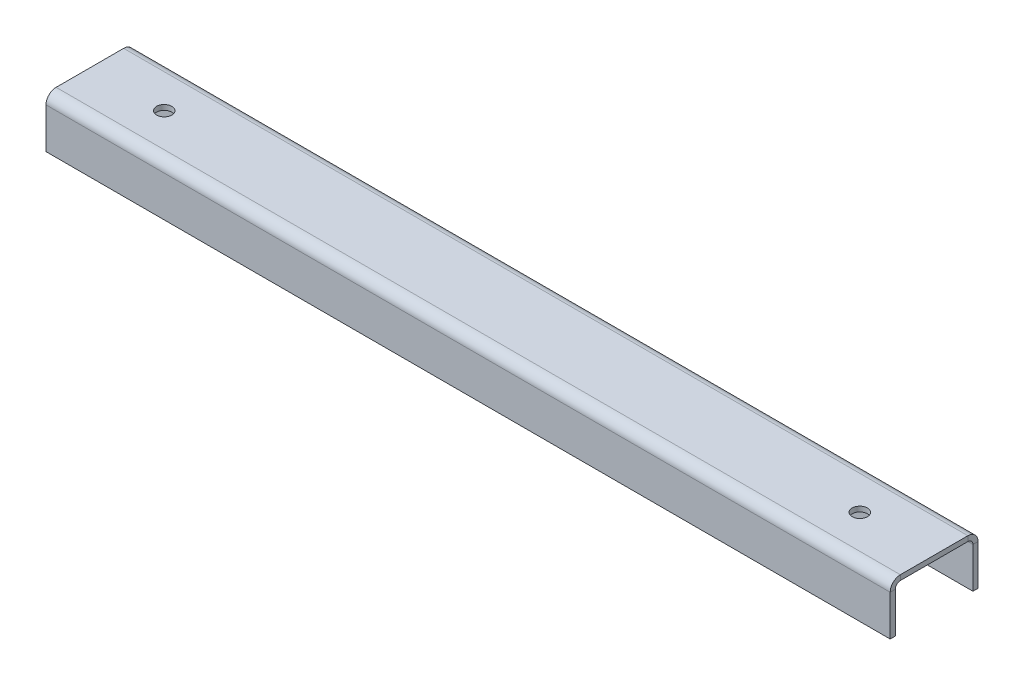
ISO-10303-21;
HEADER;
FILE_DESCRIPTION(('STEP AP214'),'2;1');
FILE_NAME('part.step','',(''),(''),'','','');
FILE_SCHEMA(('AUTOMOTIVE_DESIGN { 1 0 10303 214 1 1 1 1 }'));
ENDSEC;
DATA;
#1=APPLICATION_CONTEXT('core data for automotive mechanical design processes');
#2=APPLICATION_PROTOCOL_DEFINITION('international standard','automotive_design',2000,#1);
#3=PRODUCT_CONTEXT('',#1,'mechanical');
#4=PRODUCT('Part','Part','',(#3));
#5=PRODUCT_RELATED_PRODUCT_CATEGORY('part','',(#4));
#6=PRODUCT_DEFINITION_FORMATION('','',#4);
#7=PRODUCT_DEFINITION_CONTEXT('part definition',#1,'design');
#8=PRODUCT_DEFINITION('design','',#6,#7);
#9=PRODUCT_DEFINITION_SHAPE('','',#8);
#10=(LENGTH_UNIT() NAMED_UNIT(*) SI_UNIT(.MILLI.,.METRE.));
#11=(NAMED_UNIT(*) PLANE_ANGLE_UNIT() SI_UNIT($,.RADIAN.));
#12=(NAMED_UNIT(*) SI_UNIT($,.STERADIAN.) SOLID_ANGLE_UNIT());
#13=UNCERTAINTY_MEASURE_WITH_UNIT(LENGTH_MEASURE(1.E-05),#10,'distance_accuracy_value','');
#14=(GEOMETRIC_REPRESENTATION_CONTEXT(3) GLOBAL_UNCERTAINTY_ASSIGNED_CONTEXT((#13)) GLOBAL_UNIT_ASSIGNED_CONTEXT((#10,
#11,#12)) REPRESENTATION_CONTEXT('',''));
#15=CARTESIAN_POINT('',(0.,0.,0.));
#16=DIRECTION('',(0.,0.,1.));
#17=DIRECTION('',(1.,0.,0.));
#18=AXIS2_PLACEMENT_3D('',#15,#16,#17);
#19=CARTESIAN_POINT('',(198.448727021121,-33996.0636278408,-8130.29635445669));
#20=DIRECTION('',(-1.,0.,0.));
#21=DIRECTION('',(0.,0.,1.));
#22=AXIS2_PLACEMENT_3D('',#19,#20,#21);
#23=PLANE('',#22);
#24=DIRECTION('',(0.,0.,1.));
#25=VECTOR('',#24,1.);
#26=CARTESIAN_POINT('',(198.448727021121,-33993.0636278408,-8130.29635445669));
#27=LINE('',#26,#25);
#28=CARTESIAN_POINT('',(198.448727021121,-33993.0636278408,-8130.29635445669));
#29=VERTEX_POINT('',#28);
#30=CARTESIAN_POINT('',(198.448727021121,-33993.0636278408,-8090.29635445669));
#31=VERTEX_POINT('',#30);
#32=EDGE_CURVE('E270',#29,#31,#27,.T.);
#33=ORIENTED_EDGE('',*,*,#32,.F.);
#34=DIRECTION('',(0.,1.,0.));
#35=VECTOR('',#34,1.);
#36=CARTESIAN_POINT('',(198.448727021121,-33996.0636278408,-8130.29635445669));
#37=LINE('',#36,#35);
#38=CARTESIAN_POINT('',(198.448727021121,-33996.0636278408,-8130.29635445669));
#39=VERTEX_POINT('',#38);
#40=EDGE_CURVE('E13',#39,#29,#37,.T.);
#41=ORIENTED_EDGE('',*,*,#40,.F.);
#42=DIRECTION('',(0.,0.,1.));
#43=VECTOR('',#42,1.);
#44=CARTESIAN_POINT('',(198.448727021121,-33996.0636278408,-8130.29635445669));
#45=LINE('',#44,#43);
#46=CARTESIAN_POINT('',(198.448727021121,-33996.0636278408,-8090.29635445669));
#47=VERTEX_POINT('',#46);
#48=EDGE_CURVE('E273',#39,#47,#45,.T.);
#49=ORIENTED_EDGE('',*,*,#48,.T.);
#50=DIRECTION('',(0.,1.,0.));
#51=VECTOR('',#50,1.);
#52=CARTESIAN_POINT('',(198.448727021121,-33996.0636278408,-8090.29635445669));
#53=LINE('',#52,#51);
#54=EDGE_CURVE('E82',#47,#31,#53,.T.);
#55=ORIENTED_EDGE('',*,*,#54,.T.);
#56=EDGE_LOOP('',(#33,#41,#49,#55));
#57=FACE_BOUND('',#56,.T.);
#58=ADVANCED_FACE('F79',(#57),#23,.T.);
#59=CARTESIAN_POINT('',(698.448727021121,-33996.0636278408,-8130.29635445669));
#60=DIRECTION('',(1.,0.,0.));
#61=DIRECTION('',(0.,0.,-1.));
#62=AXIS2_PLACEMENT_3D('',#59,#60,#61);
#63=PLANE('',#62);
#64=DIRECTION('',(0.,0.,-1.));
#65=VECTOR('',#64,1.);
#66=CARTESIAN_POINT('',(698.448727021121,-33993.0636278408,-8130.29635445669));
#67=LINE('',#66,#65);
#68=CARTESIAN_POINT('',(698.448727021121,-33993.0636278408,-8090.29635445669));
#69=VERTEX_POINT('',#68);
#70=CARTESIAN_POINT('',(698.448727021121,-33993.0636278408,-8130.29635445669));
#71=VERTEX_POINT('',#70);
#72=EDGE_CURVE('E289',#69,#71,#67,.T.);
#73=ORIENTED_EDGE('',*,*,#72,.F.);
#74=DIRECTION('',(0.,1.,0.));
#75=VECTOR('',#74,1.);
#76=CARTESIAN_POINT('',(698.448727021121,-33996.0636278408,-8090.29635445669));
#77=LINE('',#76,#75);
#78=CARTESIAN_POINT('',(698.448727021121,-33996.0636278408,-8090.29635445669));
#79=VERTEX_POINT('',#78);
#80=EDGE_CURVE('E295',#79,#69,#77,.T.);
#81=ORIENTED_EDGE('',*,*,#80,.F.);
#82=DIRECTION('',(0.,0.,-1.));
#83=VECTOR('',#82,1.);
#84=CARTESIAN_POINT('',(698.448727021121,-33996.0636278408,-8130.29635445669));
#85=LINE('',#84,#83);
#86=CARTESIAN_POINT('',(698.448727021121,-33996.0636278408,-8130.29635445669));
#87=VERTEX_POINT('',#86);
#88=EDGE_CURVE('E279',#79,#87,#85,.T.);
#89=ORIENTED_EDGE('',*,*,#88,.T.);
#90=DIRECTION('',(0.,1.,0.));
#91=VECTOR('',#90,1.);
#92=CARTESIAN_POINT('',(698.448727021121,-33996.0636278408,-8130.29635445669));
#93=LINE('',#92,#91);
#94=EDGE_CURVE('E87',#87,#71,#93,.T.);
#95=ORIENTED_EDGE('',*,*,#94,.T.);
#96=EDGE_LOOP('',(#73,#81,#89,#95));
#97=FACE_BOUND('',#96,.T.);
#98=ADVANCED_FACE('F315',(#97),#63,.T.);
#99=CARTESIAN_POINT('',(0.,-33996.0636278408,0.));
#100=DIRECTION('',(0.,1.,0.));
#101=DIRECTION('',(0.,0.,1.));
#102=AXIS2_PLACEMENT_3D('',#99,#100,#101);
#103=PLANE('',#102);
#104=CARTESIAN_POINT('',(654.448727021121,-33996.0636278408,-8110.29635445669));
#105=DIRECTION('',(0.,1.,0.));
#106=DIRECTION('',(0.,0.,1.));
#107=AXIS2_PLACEMENT_3D('',#104,#105,#106);
#108=CIRCLE('',#107,4.49999999999992);
#109=CARTESIAN_POINT('',(654.448727021121,-33996.0636278408,-8105.79635445669));
#110=VERTEX_POINT('',#109);
#111=EDGE_CURVE('E261',#110,#110,#108,.T.);
#112=ORIENTED_EDGE('',*,*,#111,.T.);
#113=EDGE_LOOP('',(#112));
#114=FACE_BOUND('',#113,.T.);
#115=CARTESIAN_POINT('',(242.448727021121,-33996.0636278408,-8110.29635445669));
#116=DIRECTION('',(0.,1.,0.));
#117=DIRECTION('',(0.,0.,1.));
#118=AXIS2_PLACEMENT_3D('',#115,#116,#117);
#119=CIRCLE('',#118,4.49999999999982);
#120=CARTESIAN_POINT('',(242.448727021121,-33996.0636278408,-8105.79635445669));
#121=VERTEX_POINT('',#120);
#122=EDGE_CURVE('E267',#121,#121,#119,.T.);
#123=ORIENTED_EDGE('',*,*,#122,.T.);
#124=EDGE_LOOP('',(#123));
#125=FACE_BOUND('',#124,.T.);
#126=ORIENTED_EDGE('',*,*,#48,.F.);
#127=DIRECTION('',(-1.,0.,0.));
#128=VECTOR('',#127,1.);
#129=CARTESIAN_POINT('',(198.448727021121,-33996.0636278408,-8130.29635445669));
#130=LINE('',#129,#128);
#131=EDGE_CURVE('E282',#87,#39,#130,.T.);
#132=ORIENTED_EDGE('',*,*,#131,.F.);
#133=ORIENTED_EDGE('',*,*,#88,.F.);
#134=DIRECTION('',(1.,0.,0.));
#135=VECTOR('',#134,1.);
#136=CARTESIAN_POINT('',(198.448727021121,-33996.0636278408,-8090.29635445669));
#137=LINE('',#136,#135);
#138=EDGE_CURVE('E276',#47,#79,#137,.T.);
#139=ORIENTED_EDGE('',*,*,#138,.F.);
#140=EDGE_LOOP('',(#126,#132,#133,#139));
#141=FACE_BOUND('',#140,.T.);
#142=ADVANCED_FACE('F320',(#114,#125,#141),#103,.F.);
#143=CARTESIAN_POINT('',(0.,-33993.0636278408,0.));
#144=DIRECTION('',(0.,1.,0.));
#145=DIRECTION('',(0.,0.,1.));
#146=AXIS2_PLACEMENT_3D('',#143,#144,#145);
#147=PLANE('',#146);
#148=CARTESIAN_POINT('',(654.448727021121,-33993.0636278408,-8110.29635445669));
#149=DIRECTION('',(0.,1.,0.));
#150=DIRECTION('',(0.,0.,1.));
#151=AXIS2_PLACEMENT_3D('',#148,#149,#150);
#152=CIRCLE('',#151,4.49999999999992);
#153=CARTESIAN_POINT('',(654.448727021121,-33993.0636278408,-8105.79635445669));
#154=VERTEX_POINT('',#153);
#155=EDGE_CURVE('E252',#154,#154,#152,.T.);
#156=ORIENTED_EDGE('',*,*,#155,.F.);
#157=EDGE_LOOP('',(#156));
#158=FACE_BOUND('',#157,.T.);
#159=CARTESIAN_POINT('',(242.448727021121,-33993.0636278408,-8110.29635445669));
#160=DIRECTION('',(0.,1.,0.));
#161=DIRECTION('',(0.,0.,1.));
#162=AXIS2_PLACEMENT_3D('',#159,#160,#161);
#163=CIRCLE('',#162,4.49999999999982);
#164=CARTESIAN_POINT('',(242.448727021121,-33993.0636278408,-8105.79635445669));
#165=VERTEX_POINT('',#164);
#166=EDGE_CURVE('E264',#165,#165,#163,.T.);
#167=ORIENTED_EDGE('',*,*,#166,.F.);
#168=EDGE_LOOP('',(#167));
#169=FACE_BOUND('',#168,.T.);
#170=ORIENTED_EDGE('',*,*,#32,.T.);
#171=DIRECTION('',(1.,0.,0.));
#172=VECTOR('',#171,1.);
#173=CARTESIAN_POINT('',(198.448727021121,-33993.0636278408,-8090.29635445669));
#174=LINE('',#173,#172);
#175=EDGE_CURVE('E286',#31,#69,#174,.T.);
#176=ORIENTED_EDGE('',*,*,#175,.T.);
#177=ORIENTED_EDGE('',*,*,#72,.T.);
#178=DIRECTION('',(-1.,0.,0.));
#179=VECTOR('',#178,1.);
#180=CARTESIAN_POINT('',(198.448727021121,-33993.0636278408,-8130.29635445669));
#181=LINE('',#180,#179);
#182=EDGE_CURVE('E277',#71,#29,#181,.T.);
#183=ORIENTED_EDGE('',*,*,#182,.T.);
#184=EDGE_LOOP('',(#170,#176,#177,#183));
#185=FACE_BOUND('',#184,.T.);
#186=ADVANCED_FACE('F308',(#158,#169,#185),#147,.T.);
#187=CARTESIAN_POINT('',(242.448727021121,-33996.0636278408,-8110.29635445669));
#188=DIRECTION('',(0.,1.,0.));
#189=DIRECTION('',(0.,0.,1.));
#190=AXIS2_PLACEMENT_3D('',#187,#188,#189);
#191=CYLINDRICAL_SURFACE('',#190,4.49999999999982);
#192=ORIENTED_EDGE('',*,*,#122,.F.);
#193=EDGE_LOOP('',(#192));
#194=FACE_BOUND('',#193,.T.);
#195=ORIENTED_EDGE('',*,*,#166,.T.);
#196=EDGE_LOOP('',(#195));
#197=FACE_BOUND('',#196,.T.);
#198=ADVANCED_FACE('F350',(#194,#197),#191,.F.);
#199=CARTESIAN_POINT('',(654.448727021121,-33996.0636278408,-8110.29635445669));
#200=DIRECTION('',(0.,1.,0.));
#201=DIRECTION('',(0.,0.,1.));
#202=AXIS2_PLACEMENT_3D('',#199,#200,#201);
#203=CYLINDRICAL_SURFACE('',#202,4.49999999999992);
#204=ORIENTED_EDGE('',*,*,#111,.F.);
#205=EDGE_LOOP('',(#204));
#206=FACE_BOUND('',#205,.T.);
#207=ORIENTED_EDGE('',*,*,#155,.T.);
#208=EDGE_LOOP('',(#207));
#209=FACE_BOUND('',#208,.T.);
#210=ADVANCED_FACE('F355',(#206,#209),#203,.F.);
#211=CARTESIAN_POINT('',(698.448727021121,-33999.0636278408,-8090.29635445669));
#212=DIRECTION('',(1.,0.,0.));
#213=DIRECTION('',(0.,0.,-1.));
#214=AXIS2_PLACEMENT_3D('',#211,#212,#213);
#215=PLANE('',#214);
#216=DIRECTION('',(0.,0.,-1.));
#217=VECTOR('',#216,1.);
#218=CARTESIAN_POINT('',(698.448727021121,-33999.0636278408,-8084.29635445669));
#219=LINE('',#218,#217);
#220=CARTESIAN_POINT('',(698.448727021121,-33999.0636278408,-8087.29635445669));
#221=VERTEX_POINT('',#220);
#222=CARTESIAN_POINT('',(698.448727021121,-33999.0636278408,-8084.29635445669));
#223=VERTEX_POINT('',#222);
#224=EDGE_CURVE('E211',#221,#223,#219,.F.);
#225=ORIENTED_EDGE('',*,*,#224,.F.);
#226=CARTESIAN_POINT('',(698.448727021121,-33999.0636278408,-8090.29635445669));
#227=DIRECTION('',(-1.,0.,0.));
#228=DIRECTION('',(0.,0.,1.));
#229=AXIS2_PLACEMENT_3D('',#226,#227,#228);
#230=CIRCLE('',#229,3.00000000000011);
#231=EDGE_CURVE('E256',#79,#221,#230,.F.);
#232=ORIENTED_EDGE('',*,*,#231,.F.);
#233=ORIENTED_EDGE('',*,*,#80,.T.);
#234=CARTESIAN_POINT('',(698.448727021121,-33999.0636278408,-8090.29635445669));
#235=DIRECTION('',(-1.,0.,0.));
#236=DIRECTION('',(0.,0.,1.));
#237=AXIS2_PLACEMENT_3D('',#234,#235,#236);
#238=CIRCLE('',#237,6.00000000000011);
#239=EDGE_CURVE('E102',#69,#223,#238,.F.);
#240=ORIENTED_EDGE('',*,*,#239,.T.);
#241=EDGE_LOOP('',(#225,#232,#233,#240));
#242=FACE_BOUND('',#241,.T.);
#243=ADVANCED_FACE('F359',(#242),#215,.T.);
#244=CARTESIAN_POINT('',(198.448727021121,-33999.0636278408,-8090.29635445669));
#245=DIRECTION('',(1.,0.,0.));
#246=DIRECTION('',(0.,0.,-1.));
#247=AXIS2_PLACEMENT_3D('',#244,#245,#246);
#248=PLANE('',#247);
#249=CARTESIAN_POINT('',(198.448727021121,-33999.0636278408,-8090.29635445669));
#250=DIRECTION('',(-1.,0.,0.));
#251=DIRECTION('',(0.,0.,1.));
#252=AXIS2_PLACEMENT_3D('',#249,#250,#251);
#253=CIRCLE('',#252,3.00000000000011);
#254=CARTESIAN_POINT('',(198.448727021121,-33999.0636278408,-8087.29635445669));
#255=VERTEX_POINT('',#254);
#256=EDGE_CURVE('E224',#255,#47,#253,.T.);
#257=ORIENTED_EDGE('',*,*,#256,.F.);
#258=DIRECTION('',(0.,0.,-1.));
#259=VECTOR('',#258,1.);
#260=CARTESIAN_POINT('',(198.448727021121,-33999.0636278408,-8087.29635445669));
#261=LINE('',#260,#259);
#262=CARTESIAN_POINT('',(198.448727021121,-33999.0636278408,-8084.29635445669));
#263=VERTEX_POINT('',#262);
#264=EDGE_CURVE('E244',#255,#263,#261,.F.);
#265=ORIENTED_EDGE('',*,*,#264,.T.);
#266=CARTESIAN_POINT('',(198.448727021121,-33999.0636278408,-8090.29635445669));
#267=DIRECTION('',(-1.,0.,0.));
#268=DIRECTION('',(0.,0.,1.));
#269=AXIS2_PLACEMENT_3D('',#266,#267,#268);
#270=CIRCLE('',#269,6.00000000000011);
#271=EDGE_CURVE('E253',#263,#31,#270,.T.);
#272=ORIENTED_EDGE('',*,*,#271,.T.);
#273=ORIENTED_EDGE('',*,*,#54,.F.);
#274=EDGE_LOOP('',(#257,#265,#272,#273));
#275=FACE_BOUND('',#274,.T.);
#276=ADVANCED_FACE('F361',(#275),#248,.F.);
#277=CARTESIAN_POINT('',(198.448727021121,-33999.0636278408,-8090.29635445669));
#278=DIRECTION('',(-1.,0.,0.));
#279=DIRECTION('',(0.,0.,1.));
#280=AXIS2_PLACEMENT_3D('',#277,#278,#279);
#281=CYLINDRICAL_SURFACE('',#280,6.00000000000011);
#282=ORIENTED_EDGE('',*,*,#175,.F.);
#283=ORIENTED_EDGE('',*,*,#271,.F.);
#284=DIRECTION('',(-1.,0.,0.));
#285=VECTOR('',#284,1.);
#286=CARTESIAN_POINT('',(698.448727021121,-33999.0636278408,-8084.29635445669));
#287=LINE('',#286,#285);
#288=EDGE_CURVE('E242',#263,#223,#287,.F.);
#289=ORIENTED_EDGE('',*,*,#288,.T.);
#290=ORIENTED_EDGE('',*,*,#239,.F.);
#291=EDGE_LOOP('',(#282,#283,#289,#290));
#292=FACE_BOUND('',#291,.T.);
#293=ADVANCED_FACE('F364',(#292),#281,.T.);
#294=CARTESIAN_POINT('',(198.448727021121,-33999.0636278408,-8090.29635445669));
#295=DIRECTION('',(-1.,0.,0.));
#296=DIRECTION('',(0.,0.,1.));
#297=AXIS2_PLACEMENT_3D('',#294,#295,#296);
#298=CYLINDRICAL_SURFACE('',#297,3.00000000000011);
#299=ORIENTED_EDGE('',*,*,#138,.T.);
#300=ORIENTED_EDGE('',*,*,#231,.T.);
#301=DIRECTION('',(-1.,0.,0.));
#302=VECTOR('',#301,1.);
#303=CARTESIAN_POINT('',(698.448727021121,-33999.0636278408,-8087.29635445669));
#304=LINE('',#303,#302);
#305=EDGE_CURVE('E247',#221,#255,#304,.T.);
#306=ORIENTED_EDGE('',*,*,#305,.T.);
#307=ORIENTED_EDGE('',*,*,#256,.T.);
#308=EDGE_LOOP('',(#299,#300,#306,#307));
#309=FACE_BOUND('',#308,.T.);
#310=ADVANCED_FACE('F367',(#309),#298,.F.);
#311=CARTESIAN_POINT('',(198.448727021121,-34023.0636278408,-8084.29635445669));
#312=DIRECTION('',(1.,0.,0.));
#313=DIRECTION('',(0.,0.,-1.));
#314=AXIS2_PLACEMENT_3D('',#311,#312,#313);
#315=PLANE('',#314);
#316=ORIENTED_EDGE('',*,*,#264,.F.);
#317=DIRECTION('',(0.,1.,0.));
#318=VECTOR('',#317,1.);
#319=CARTESIAN_POINT('',(198.448727021121,-34023.0636278408,-8087.29635445669));
#320=LINE('',#319,#318);
#321=CARTESIAN_POINT('',(198.448727021121,-34023.0636278408,-8087.29635445669));
#322=VERTEX_POINT('',#321);
#323=EDGE_CURVE('E240',#255,#322,#320,.F.);
#324=ORIENTED_EDGE('',*,*,#323,.T.);
#325=DIRECTION('',(0.,0.,-1.));
#326=VECTOR('',#325,1.);
#327=CARTESIAN_POINT('',(198.448727021121,-34023.0636278408,-8084.29635445669));
#328=LINE('',#327,#326);
#329=CARTESIAN_POINT('',(198.448727021121,-34023.0636278408,-8084.29635445669));
#330=VERTEX_POINT('',#329);
#331=EDGE_CURVE('E221',#330,#322,#328,.T.);
#332=ORIENTED_EDGE('',*,*,#331,.F.);
#333=DIRECTION('',(0.,-1.,0.));
#334=VECTOR('',#333,1.);
#335=CARTESIAN_POINT('',(198.448727021121,0.,-8084.29635445669));
#336=LINE('',#335,#334);
#337=EDGE_CURVE('E233',#263,#330,#336,.T.);
#338=ORIENTED_EDGE('',*,*,#337,.F.);
#339=EDGE_LOOP('',(#316,#324,#332,#338));
#340=FACE_BOUND('',#339,.T.);
#341=ADVANCED_FACE('F370',(#340),#315,.F.);
#342=CARTESIAN_POINT('',(698.448727021121,-33996.0636278408,-8084.29635445669));
#343=DIRECTION('',(-1.,0.,0.));
#344=DIRECTION('',(0.,0.,1.));
#345=AXIS2_PLACEMENT_3D('',#342,#343,#344);
#346=PLANE('',#345);
#347=ORIENTED_EDGE('',*,*,#224,.T.);
#348=DIRECTION('',(0.,1.,0.));
#349=VECTOR('',#348,1.);
#350=CARTESIAN_POINT('',(698.448727021121,0.,-8084.29635445669));
#351=LINE('',#350,#349);
#352=CARTESIAN_POINT('',(698.448727021121,-34023.0636278408,-8084.29635445669));
#353=VERTEX_POINT('',#352);
#354=EDGE_CURVE('E228',#353,#223,#351,.T.);
#355=ORIENTED_EDGE('',*,*,#354,.F.);
#356=DIRECTION('',(0.,0.,-1.));
#357=VECTOR('',#356,1.);
#358=CARTESIAN_POINT('',(698.448727021121,-34023.0636278408,-8084.29635445669));
#359=LINE('',#358,#357);
#360=CARTESIAN_POINT('',(698.448727021121,-34023.0636278408,-8087.29635445669));
#361=VERTEX_POINT('',#360);
#362=EDGE_CURVE('E225',#353,#361,#359,.T.);
#363=ORIENTED_EDGE('',*,*,#362,.T.);
#364=DIRECTION('',(0.,-1.,0.));
#365=VECTOR('',#364,1.);
#366=CARTESIAN_POINT('',(698.448727021121,-33996.0636278408,-8087.29635445669));
#367=LINE('',#366,#365);
#368=EDGE_CURVE('E235',#361,#221,#367,.F.);
#369=ORIENTED_EDGE('',*,*,#368,.T.);
#370=EDGE_LOOP('',(#347,#355,#363,#369));
#371=FACE_BOUND('',#370,.T.);
#372=ADVANCED_FACE('F375',(#371),#346,.F.);
#373=CARTESIAN_POINT('',(0.,0.,-8084.29635445669));
#374=DIRECTION('',(0.,0.,-1.));
#375=DIRECTION('',(-1.,0.,0.));
#376=AXIS2_PLACEMENT_3D('',#373,#374,#375);
#377=PLANE('',#376);
#378=ORIENTED_EDGE('',*,*,#288,.F.);
#379=ORIENTED_EDGE('',*,*,#337,.T.);
#380=DIRECTION('',(1.,0.,0.));
#381=VECTOR('',#380,1.);
#382=CARTESIAN_POINT('',(0.,-34023.0636278408,-8084.29635445669));
#383=LINE('',#382,#381);
#384=EDGE_CURVE('E231',#330,#353,#383,.T.);
#385=ORIENTED_EDGE('',*,*,#384,.T.);
#386=ORIENTED_EDGE('',*,*,#354,.T.);
#387=EDGE_LOOP('',(#378,#379,#385,#386));
#388=FACE_BOUND('',#387,.T.);
#389=ADVANCED_FACE('F380',(#388),#377,.F.);
#390=CARTESIAN_POINT('',(0.,0.,-8087.29635445669));
#391=DIRECTION('',(0.,0.,-1.));
#392=DIRECTION('',(-1.,0.,0.));
#393=AXIS2_PLACEMENT_3D('',#390,#391,#392);
#394=PLANE('',#393);
#395=ORIENTED_EDGE('',*,*,#323,.F.);
#396=ORIENTED_EDGE('',*,*,#305,.F.);
#397=ORIENTED_EDGE('',*,*,#368,.F.);
#398=DIRECTION('',(-1.,0.,0.));
#399=VECTOR('',#398,1.);
#400=CARTESIAN_POINT('',(698.448727021121,-34023.0636278408,-8087.29635445669));
#401=LINE('',#400,#399);
#402=EDGE_CURVE('E238',#322,#361,#401,.F.);
#403=ORIENTED_EDGE('',*,*,#402,.F.);
#404=EDGE_LOOP('',(#395,#396,#397,#403));
#405=FACE_BOUND('',#404,.T.);
#406=ADVANCED_FACE('F335',(#405),#394,.T.);
#407=CARTESIAN_POINT('',(698.448727021121,-34023.0636278408,-8084.29635445669));
#408=DIRECTION('',(0.,1.,0.));
#409=DIRECTION('',(0.,0.,1.));
#410=AXIS2_PLACEMENT_3D('',#407,#408,#409);
#411=PLANE('',#410);
#412=ORIENTED_EDGE('',*,*,#402,.T.);
#413=ORIENTED_EDGE('',*,*,#362,.F.);
#414=ORIENTED_EDGE('',*,*,#384,.F.);
#415=ORIENTED_EDGE('',*,*,#331,.T.);
#416=EDGE_LOOP('',(#412,#413,#414,#415));
#417=FACE_BOUND('',#416,.T.);
#418=ADVANCED_FACE('F328',(#417),#411,.F.);
#419=CARTESIAN_POINT('',(198.448727021121,-33999.0636278408,-8130.29635445669));
#420=DIRECTION('',(-1.,0.,0.));
#421=DIRECTION('',(0.,0.,1.));
#422=AXIS2_PLACEMENT_3D('',#419,#420,#421);
#423=PLANE('',#422);
#424=DIRECTION('',(0.,0.,1.));
#425=VECTOR('',#424,1.);
#426=CARTESIAN_POINT('',(198.448727021121,-33999.0636278408,-8136.29635445669));
#427=LINE('',#426,#425);
#428=CARTESIAN_POINT('',(198.448727021121,-33999.0636278408,-8133.29635445669));
#429=VERTEX_POINT('',#428);
#430=CARTESIAN_POINT('',(198.448727021121,-33999.0636278408,-8136.29635445669));
#431=VERTEX_POINT('',#430);
#432=EDGE_CURVE('E192',#429,#431,#427,.F.);
#433=ORIENTED_EDGE('',*,*,#432,.F.);
#434=CARTESIAN_POINT('',(198.448727021121,-33999.0636278408,-8130.29635445669));
#435=DIRECTION('',(1.,0.,0.));
#436=DIRECTION('',(0.,0.,-1.));
#437=AXIS2_PLACEMENT_3D('',#434,#435,#436);
#438=CIRCLE('',#437,3.00000000000011);
#439=EDGE_CURVE('E215',#39,#429,#438,.F.);
#440=ORIENTED_EDGE('',*,*,#439,.F.);
#441=ORIENTED_EDGE('',*,*,#40,.T.);
#442=CARTESIAN_POINT('',(198.448727021121,-33999.0636278408,-8130.29635445669));
#443=DIRECTION('',(1.,0.,0.));
#444=DIRECTION('',(0.,0.,-1.));
#445=AXIS2_PLACEMENT_3D('',#442,#443,#444);
#446=CIRCLE('',#445,6.00000000000011);
#447=EDGE_CURVE('E95',#29,#431,#446,.F.);
#448=ORIENTED_EDGE('',*,*,#447,.T.);
#449=EDGE_LOOP('',(#433,#440,#441,#448));
#450=FACE_BOUND('',#449,.T.);
#451=ADVANCED_FACE('F326',(#450),#423,.T.);
#452=CARTESIAN_POINT('',(698.448727021121,-33999.0636278408,-8130.29635445669));
#453=DIRECTION('',(-1.,0.,0.));
#454=DIRECTION('',(0.,0.,1.));
#455=AXIS2_PLACEMENT_3D('',#452,#453,#454);
#456=PLANE('',#455);
#457=CARTESIAN_POINT('',(698.448727021121,-33999.0636278408,-8130.29635445669));
#458=DIRECTION('',(1.,0.,0.));
#459=DIRECTION('',(0.,0.,-1.));
#460=AXIS2_PLACEMENT_3D('',#457,#458,#459);
#461=CIRCLE('',#460,3.00000000000011);
#462=CARTESIAN_POINT('',(698.448727021121,-33999.0636278408,-8133.29635445669));
#463=VERTEX_POINT('',#462);
#464=EDGE_CURVE('E218',#463,#87,#461,.T.);
#465=ORIENTED_EDGE('',*,*,#464,.F.);
#466=DIRECTION('',(0.,0.,1.));
#467=VECTOR('',#466,1.);
#468=CARTESIAN_POINT('',(698.448727021121,-33999.0636278408,-8133.29635445669));
#469=LINE('',#468,#467);
#470=CARTESIAN_POINT('',(698.448727021121,-33999.0636278408,-8136.29635445669));
#471=VERTEX_POINT('',#470);
#472=EDGE_CURVE('E204',#463,#471,#469,.F.);
#473=ORIENTED_EDGE('',*,*,#472,.T.);
#474=CARTESIAN_POINT('',(698.448727021121,-33999.0636278408,-8130.29635445669));
#475=DIRECTION('',(1.,0.,0.));
#476=DIRECTION('',(0.,0.,-1.));
#477=AXIS2_PLACEMENT_3D('',#474,#475,#476);
#478=CIRCLE('',#477,6.00000000000011);
#479=EDGE_CURVE('E212',#471,#71,#478,.T.);
#480=ORIENTED_EDGE('',*,*,#479,.T.);
#481=ORIENTED_EDGE('',*,*,#94,.F.);
#482=EDGE_LOOP('',(#465,#473,#480,#481));
#483=FACE_BOUND('',#482,.T.);
#484=ADVANCED_FACE('F312',(#483),#456,.F.);
#485=CARTESIAN_POINT('',(698.448727021121,-33999.0636278408,-8130.29635445669));
#486=DIRECTION('',(1.,0.,0.));
#487=DIRECTION('',(0.,0.,-1.));
#488=AXIS2_PLACEMENT_3D('',#485,#486,#487);
#489=CYLINDRICAL_SURFACE('',#488,6.00000000000011);
#490=ORIENTED_EDGE('',*,*,#182,.F.);
#491=ORIENTED_EDGE('',*,*,#479,.F.);
#492=DIRECTION('',(1.,0.,0.));
#493=VECTOR('',#492,1.);
#494=CARTESIAN_POINT('',(198.448727021121,-33999.0636278408,-8136.29635445669));
#495=LINE('',#494,#493);
#496=EDGE_CURVE('E202',#471,#431,#495,.F.);
#497=ORIENTED_EDGE('',*,*,#496,.T.);
#498=ORIENTED_EDGE('',*,*,#447,.F.);
#499=EDGE_LOOP('',(#490,#491,#497,#498));
#500=FACE_BOUND('',#499,.T.);
#501=ADVANCED_FACE('F309',(#500),#489,.T.);
#502=CARTESIAN_POINT('',(698.448727021121,-33999.0636278408,-8130.29635445669));
#503=DIRECTION('',(1.,0.,0.));
#504=DIRECTION('',(0.,0.,-1.));
#505=AXIS2_PLACEMENT_3D('',#502,#503,#504);
#506=CYLINDRICAL_SURFACE('',#505,3.00000000000011);
#507=ORIENTED_EDGE('',*,*,#131,.T.);
#508=ORIENTED_EDGE('',*,*,#439,.T.);
#509=DIRECTION('',(1.,0.,0.));
#510=VECTOR('',#509,1.);
#511=CARTESIAN_POINT('',(198.448727021121,-33999.0636278408,-8133.29635445669));
#512=LINE('',#511,#510);
#513=EDGE_CURVE('E207',#429,#463,#512,.T.);
#514=ORIENTED_EDGE('',*,*,#513,.T.);
#515=ORIENTED_EDGE('',*,*,#464,.T.);
#516=EDGE_LOOP('',(#507,#508,#514,#515));
#517=FACE_BOUND('',#516,.T.);
#518=ADVANCED_FACE('F323',(#517),#506,.F.);
#519=CARTESIAN_POINT('',(698.448727021121,-34023.0636278408,-8136.29635445669));
#520=DIRECTION('',(-1.,0.,0.));
#521=DIRECTION('',(0.,0.,1.));
#522=AXIS2_PLACEMENT_3D('',#519,#520,#521);
#523=PLANE('',#522);
#524=ORIENTED_EDGE('',*,*,#472,.F.);
#525=DIRECTION('',(0.,1.,0.));
#526=VECTOR('',#525,1.);
#527=CARTESIAN_POINT('',(698.448727021121,-34023.0636278408,-8133.29635445669));
#528=LINE('',#527,#526);
#529=CARTESIAN_POINT('',(698.448727021121,-34023.0636278408,-8133.29635445669));
#530=VERTEX_POINT('',#529);
#531=EDGE_CURVE('E200',#463,#530,#528,.F.);
#532=ORIENTED_EDGE('',*,*,#531,.T.);
#533=DIRECTION('',(0.,0.,1.));
#534=VECTOR('',#533,1.);
#535=CARTESIAN_POINT('',(698.448727021121,-34023.0636278408,-8136.29635445669));
#536=LINE('',#535,#534);
#537=CARTESIAN_POINT('',(698.448727021121,-34023.0636278408,-8136.29635445669));
#538=VERTEX_POINT('',#537);
#539=EDGE_CURVE('E188',#538,#530,#536,.T.);
#540=ORIENTED_EDGE('',*,*,#539,.F.);
#541=DIRECTION('',(0.,-1.,0.));
#542=VECTOR('',#541,1.);
#543=CARTESIAN_POINT('',(698.448727021121,0.,-8136.29635445669));
#544=LINE('',#543,#542);
#545=EDGE_CURVE('E175',#471,#538,#544,.T.);
#546=ORIENTED_EDGE('',*,*,#545,.F.);
#547=EDGE_LOOP('',(#524,#532,#540,#546));
#548=FACE_BOUND('',#547,.T.);
#549=ADVANCED_FACE('F441',(#548),#523,.F.);
#550=CARTESIAN_POINT('',(198.448727021121,-33996.0636278408,-8136.29635445669));
#551=DIRECTION('',(1.,0.,0.));
#552=DIRECTION('',(0.,0.,-1.));
#553=AXIS2_PLACEMENT_3D('',#550,#551,#552);
#554=PLANE('',#553);
#555=ORIENTED_EDGE('',*,*,#432,.T.);
#556=DIRECTION('',(0.,1.,0.));
#557=VECTOR('',#556,1.);
#558=CARTESIAN_POINT('',(198.448727021121,0.,-8136.29635445669));
#559=LINE('',#558,#557);
#560=CARTESIAN_POINT('',(198.448727021121,-34023.0636278408,-8136.29635445669));
#561=VERTEX_POINT('',#560);
#562=EDGE_CURVE('E173',#561,#431,#559,.T.);
#563=ORIENTED_EDGE('',*,*,#562,.F.);
#564=DIRECTION('',(0.,0.,1.));
#565=VECTOR('',#564,1.);
#566=CARTESIAN_POINT('',(198.448727021121,-34023.0636278408,-8136.29635445669));
#567=LINE('',#566,#565);
#568=CARTESIAN_POINT('',(198.448727021121,-34023.0636278408,-8133.29635445669));
#569=VERTEX_POINT('',#568);
#570=EDGE_CURVE('E181',#561,#569,#567,.T.);
#571=ORIENTED_EDGE('',*,*,#570,.T.);
#572=DIRECTION('',(0.,-1.,0.));
#573=VECTOR('',#572,1.);
#574=CARTESIAN_POINT('',(198.448727021121,-33996.0636278408,-8133.29635445669));
#575=LINE('',#574,#573);
#576=EDGE_CURVE('E197',#569,#429,#575,.F.);
#577=ORIENTED_EDGE('',*,*,#576,.T.);
#578=EDGE_LOOP('',(#555,#563,#571,#577));
#579=FACE_BOUND('',#578,.T.);
#580=ADVANCED_FACE('F191',(#579),#554,.F.);
#581=CARTESIAN_POINT('',(0.,0.,-8136.29635445669));
#582=DIRECTION('',(0.,0.,1.));
#583=DIRECTION('',(1.,0.,0.));
#584=AXIS2_PLACEMENT_3D('',#581,#582,#583);
#585=PLANE('',#584);
#586=ORIENTED_EDGE('',*,*,#496,.F.);
#587=ORIENTED_EDGE('',*,*,#545,.T.);
#588=DIRECTION('',(-1.,0.,0.));
#589=VECTOR('',#588,1.);
#590=CARTESIAN_POINT('',(0.,-34023.0636278408,-8136.29635445669));
#591=LINE('',#590,#589);
#592=EDGE_CURVE('E168',#538,#561,#591,.T.);
#593=ORIENTED_EDGE('',*,*,#592,.T.);
#594=ORIENTED_EDGE('',*,*,#562,.T.);
#595=EDGE_LOOP('',(#586,#587,#593,#594));
#596=FACE_BOUND('',#595,.T.);
#597=ADVANCED_FACE('F171',(#596),#585,.F.);
#598=CARTESIAN_POINT('',(0.,0.,-8133.29635445669));
#599=DIRECTION('',(0.,0.,1.));
#600=DIRECTION('',(1.,0.,0.));
#601=AXIS2_PLACEMENT_3D('',#598,#599,#600);
#602=PLANE('',#601);
#603=ORIENTED_EDGE('',*,*,#531,.F.);
#604=ORIENTED_EDGE('',*,*,#513,.F.);
#605=ORIENTED_EDGE('',*,*,#576,.F.);
#606=DIRECTION('',(1.,0.,0.));
#607=VECTOR('',#606,1.);
#608=CARTESIAN_POINT('',(198.448727021121,-34023.0636278408,-8133.29635445669));
#609=LINE('',#608,#607);
#610=EDGE_CURVE('E184',#530,#569,#609,.F.);
#611=ORIENTED_EDGE('',*,*,#610,.F.);
#612=EDGE_LOOP('',(#603,#604,#605,#611));
#613=FACE_BOUND('',#612,.T.);
#614=ADVANCED_FACE('F469',(#613),#602,.T.);
#615=CARTESIAN_POINT('',(198.448727021121,-34023.0636278408,-8136.29635445669));
#616=DIRECTION('',(0.,1.,0.));
#617=DIRECTION('',(0.,0.,1.));
#618=AXIS2_PLACEMENT_3D('',#615,#616,#617);
#619=PLANE('',#618);
#620=ORIENTED_EDGE('',*,*,#610,.T.);
#621=ORIENTED_EDGE('',*,*,#570,.F.);
#622=ORIENTED_EDGE('',*,*,#592,.F.);
#623=ORIENTED_EDGE('',*,*,#539,.T.);
#624=EDGE_LOOP('',(#620,#621,#622,#623));
#625=FACE_BOUND('',#624,.T.);
#626=ADVANCED_FACE('F182',(#625),#619,.F.);
#627=CLOSED_SHELL('',(#58,#98,#142,#186,#198,#210,#243,#276,#293,#310,#341,#372,#389,#406,#418,
#451,#484,#501,#518,#549,#580,#597,#614,#626));
#628=MANIFOLD_SOLID_BREP('B2',#627);
#629=ADVANCED_BREP_SHAPE_REPRESENTATION('',(#18,#628),#14);
#630=SHAPE_DEFINITION_REPRESENTATION(#9,#629);
ENDSEC;
END-ISO-10303-21;
